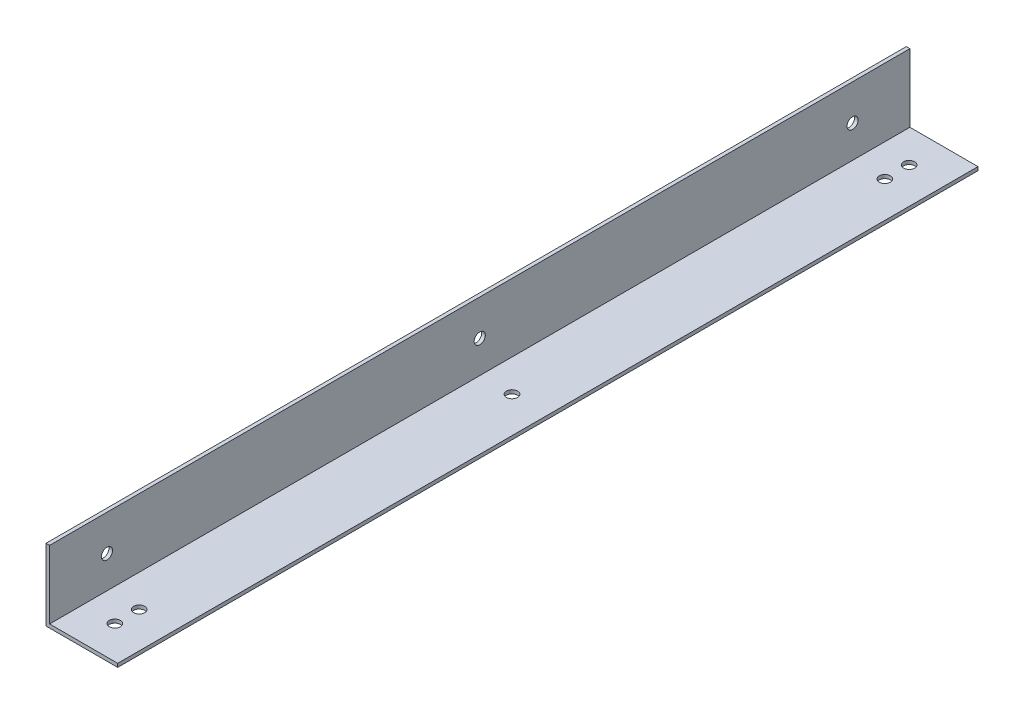
ISO-10303-21;
HEADER;
FILE_DESCRIPTION(('STEP AP214'),'2;1');
FILE_NAME('part.step','',(''),(''),'','','');
FILE_SCHEMA(('AUTOMOTIVE_DESIGN { 1 0 10303 214 1 1 1 1 }'));
ENDSEC;
DATA;
#1=APPLICATION_CONTEXT('core data for automotive mechanical design processes');
#2=APPLICATION_PROTOCOL_DEFINITION('international standard','automotive_design',2000,#1);
#3=PRODUCT_CONTEXT('',#1,'mechanical');
#4=PRODUCT('Part','Part','',(#3));
#5=PRODUCT_RELATED_PRODUCT_CATEGORY('part','',(#4));
#6=PRODUCT_DEFINITION_FORMATION('','',#4);
#7=PRODUCT_DEFINITION_CONTEXT('part definition',#1,'design');
#8=PRODUCT_DEFINITION('design','',#6,#7);
#9=PRODUCT_DEFINITION_SHAPE('','',#8);
#10=(LENGTH_UNIT() NAMED_UNIT(*) SI_UNIT(.MILLI.,.METRE.));
#11=(NAMED_UNIT(*) PLANE_ANGLE_UNIT() SI_UNIT($,.RADIAN.));
#12=(NAMED_UNIT(*) SI_UNIT($,.STERADIAN.) SOLID_ANGLE_UNIT());
#13=UNCERTAINTY_MEASURE_WITH_UNIT(LENGTH_MEASURE(1.E-05),#10,'distance_accuracy_value','');
#14=(GEOMETRIC_REPRESENTATION_CONTEXT(3) GLOBAL_UNCERTAINTY_ASSIGNED_CONTEXT((#13)) GLOBAL_UNIT_ASSIGNED_CONTEXT((#10,
#11,#12)) REPRESENTATION_CONTEXT('',''));
#15=CARTESIAN_POINT('',(0.,0.,0.));
#16=DIRECTION('',(0.,0.,1.));
#17=DIRECTION('',(1.,0.,0.));
#18=AXIS2_PLACEMENT_3D('',#15,#16,#17);
#19=CARTESIAN_POINT('',(31.75,0.,381.));
#20=DIRECTION('',(0.,1.,0.));
#21=DIRECTION('',(-1.,0.,0.));
#22=AXIS2_PLACEMENT_3D('',#19,#20,#21);
#23=PLANE('',#22);
#24=CARTESIAN_POINT('',(15.875,0.,190.5));
#25=DIRECTION('',(0.,-1.,0.));
#26=DIRECTION('',(0.,0.,-1.));
#27=AXIS2_PLACEMENT_3D('',#24,#25,#26);
#28=CIRCLE('',#27,2.45744999999999);
#29=CARTESIAN_POINT('',(15.875,0.,188.04255));
#30=VERTEX_POINT('',#29);
#31=EDGE_CURVE('E165',#30,#30,#28,.T.);
#32=ORIENTED_EDGE('',*,*,#31,.F.);
#33=EDGE_LOOP('',(#32));
#34=FACE_BOUND('',#33,.T.);
#35=CARTESIAN_POINT('',(15.875,0.,25.4));
#36=DIRECTION('',(0.,-1.,0.));
#37=DIRECTION('',(0.,0.,-1.));
#38=AXIS2_PLACEMENT_3D('',#35,#36,#37);
#39=CIRCLE('',#38,2.45744999999999);
#40=CARTESIAN_POINT('',(15.875,0.,22.94255));
#41=VERTEX_POINT('',#40);
#42=EDGE_CURVE('E169',#41,#41,#39,.T.);
#43=ORIENTED_EDGE('',*,*,#42,.F.);
#44=EDGE_LOOP('',(#43));
#45=FACE_BOUND('',#44,.T.);
#46=CARTESIAN_POINT('',(15.875,0.,355.6));
#47=DIRECTION('',(0.,-1.,0.));
#48=DIRECTION('',(0.,0.,-1.));
#49=AXIS2_PLACEMENT_3D('',#46,#47,#48);
#50=CIRCLE('',#49,2.45744999999999);
#51=CARTESIAN_POINT('',(15.875,0.,353.14255));
#52=VERTEX_POINT('',#51);
#53=EDGE_CURVE('E173',#52,#52,#50,.T.);
#54=ORIENTED_EDGE('',*,*,#53,.F.);
#55=EDGE_LOOP('',(#54));
#56=FACE_BOUND('',#55,.T.);
#57=CARTESIAN_POINT('',(15.875,0.,14.605));
#58=DIRECTION('',(0.,-1.,0.));
#59=DIRECTION('',(0.,0.,-1.));
#60=AXIS2_PLACEMENT_3D('',#57,#58,#59);
#61=CIRCLE('',#60,2.45744999999999);
#62=CARTESIAN_POINT('',(15.875,0.,12.14755));
#63=VERTEX_POINT('',#62);
#64=EDGE_CURVE('E177',#63,#63,#61,.T.);
#65=ORIENTED_EDGE('',*,*,#64,.F.);
#66=EDGE_LOOP('',(#65));
#67=FACE_BOUND('',#66,.T.);
#68=CARTESIAN_POINT('',(15.875,0.,366.395));
#69=DIRECTION('',(0.,-1.,0.));
#70=DIRECTION('',(0.,0.,-1.));
#71=AXIS2_PLACEMENT_3D('',#68,#69,#70);
#72=CIRCLE('',#71,2.45744999999999);
#73=CARTESIAN_POINT('',(15.875,0.,363.93755));
#74=VERTEX_POINT('',#73);
#75=EDGE_CURVE('E180',#74,#74,#72,.T.);
#76=ORIENTED_EDGE('',*,*,#75,.F.);
#77=EDGE_LOOP('',(#76));
#78=FACE_BOUND('',#77,.T.);
#79=DIRECTION('',(1.,0.,0.));
#80=VECTOR('',#79,1.);
#81=CARTESIAN_POINT('',(31.75,0.,0.));
#82=LINE('',#81,#80);
#83=CARTESIAN_POINT('',(0.,0.,0.));
#84=VERTEX_POINT('',#83);
#85=CARTESIAN_POINT('',(31.75,0.,0.));
#86=VERTEX_POINT('',#85);
#87=EDGE_CURVE('E118',#84,#86,#82,.T.);
#88=ORIENTED_EDGE('',*,*,#87,.T.);
#89=DIRECTION('',(0.,0.,-1.));
#90=VECTOR('',#89,1.);
#91=CARTESIAN_POINT('',(31.75,0.,381.));
#92=LINE('',#91,#90);
#93=CARTESIAN_POINT('',(31.75,0.,381.));
#94=VERTEX_POINT('',#93);
#95=EDGE_CURVE('E11',#94,#86,#92,.T.);
#96=ORIENTED_EDGE('',*,*,#95,.F.);
#97=DIRECTION('',(1.,0.,0.));
#98=VECTOR('',#97,1.);
#99=CARTESIAN_POINT('',(31.75,0.,381.));
#100=LINE('',#99,#98);
#101=CARTESIAN_POINT('',(0.,0.,381.));
#102=VERTEX_POINT('',#101);
#103=EDGE_CURVE('E129',#102,#94,#100,.T.);
#104=ORIENTED_EDGE('',*,*,#103,.F.);
#105=DIRECTION('',(0.,0.,-1.));
#106=VECTOR('',#105,1.);
#107=CARTESIAN_POINT('',(0.,0.,381.));
#108=LINE('',#107,#106);
#109=EDGE_CURVE('E114',#102,#84,#108,.T.);
#110=ORIENTED_EDGE('',*,*,#109,.T.);
#111=EDGE_LOOP('',(#88,#96,#104,#110));
#112=FACE_BOUND('',#111,.T.);
#113=ADVANCED_FACE('F33',(#34,#45,#56,#67,#78,#112),#23,.F.);
#114=CARTESIAN_POINT('',(31.75,1.5875,381.));
#115=DIRECTION('',(-1.,0.,0.));
#116=DIRECTION('',(0.,0.,1.));
#117=AXIS2_PLACEMENT_3D('',#114,#115,#116);
#118=PLANE('',#117);
#119=DIRECTION('',(0.,1.,0.));
#120=VECTOR('',#119,1.);
#121=CARTESIAN_POINT('',(31.75,1.5875,0.));
#122=LINE('',#121,#120);
#123=CARTESIAN_POINT('',(31.75,1.5875,0.));
#124=VERTEX_POINT('',#123);
#125=EDGE_CURVE('E121',#86,#124,#122,.T.);
#126=ORIENTED_EDGE('',*,*,#125,.T.);
#127=DIRECTION('',(0.,0.,-1.));
#128=VECTOR('',#127,1.);
#129=CARTESIAN_POINT('',(31.75,1.5875,381.));
#130=LINE('',#129,#128);
#131=CARTESIAN_POINT('',(31.75,1.5875,381.));
#132=VERTEX_POINT('',#131);
#133=EDGE_CURVE('E42',#132,#124,#130,.T.);
#134=ORIENTED_EDGE('',*,*,#133,.F.);
#135=DIRECTION('',(0.,1.,0.));
#136=VECTOR('',#135,1.);
#137=CARTESIAN_POINT('',(31.75,1.5875,381.));
#138=LINE('',#137,#136);
#139=EDGE_CURVE('E87',#94,#132,#138,.T.);
#140=ORIENTED_EDGE('',*,*,#139,.F.);
#141=ORIENTED_EDGE('',*,*,#95,.T.);
#142=EDGE_LOOP('',(#126,#134,#140,#141));
#143=FACE_BOUND('',#142,.T.);
#144=ADVANCED_FACE('F157',(#143),#118,.F.);
#145=CARTESIAN_POINT('',(1.5875,1.5875,381.));
#146=DIRECTION('',(0.,-1.,0.));
#147=DIRECTION('',(1.,0.,0.));
#148=AXIS2_PLACEMENT_3D('',#145,#146,#147);
#149=PLANE('',#148);
#150=CARTESIAN_POINT('',(15.875,1.5875,190.5));
#151=DIRECTION('',(0.,-1.,0.));
#152=DIRECTION('',(1.,0.,0.));
#153=AXIS2_PLACEMENT_3D('',#150,#151,#152);
#154=CIRCLE('',#153,2.45744999999999);
#155=CARTESIAN_POINT('',(18.33245,1.5875,190.5));
#156=VERTEX_POINT('',#155);
#157=EDGE_CURVE('E251',#156,#156,#154,.T.);
#158=ORIENTED_EDGE('',*,*,#157,.T.);
#159=EDGE_LOOP('',(#158));
#160=FACE_BOUND('',#159,.T.);
#161=CARTESIAN_POINT('',(15.875,1.5875,25.4));
#162=DIRECTION('',(0.,-1.,0.));
#163=DIRECTION('',(1.,0.,0.));
#164=AXIS2_PLACEMENT_3D('',#161,#162,#163);
#165=CIRCLE('',#164,2.45744999999999);
#166=CARTESIAN_POINT('',(18.33245,1.5875,25.4));
#167=VERTEX_POINT('',#166);
#168=EDGE_CURVE('E36',#167,#167,#165,.T.);
#169=ORIENTED_EDGE('',*,*,#168,.T.);
#170=EDGE_LOOP('',(#169));
#171=FACE_BOUND('',#170,.T.);
#172=CARTESIAN_POINT('',(15.875,1.5875,355.6));
#173=DIRECTION('',(0.,-1.,0.));
#174=DIRECTION('',(1.,0.,0.));
#175=AXIS2_PLACEMENT_3D('',#172,#173,#174);
#176=CIRCLE('',#175,2.45744999999999);
#177=CARTESIAN_POINT('',(18.33245,1.5875,355.6));
#178=VERTEX_POINT('',#177);
#179=EDGE_CURVE('E258',#178,#178,#176,.T.);
#180=ORIENTED_EDGE('',*,*,#179,.T.);
#181=EDGE_LOOP('',(#180));
#182=FACE_BOUND('',#181,.T.);
#183=CARTESIAN_POINT('',(15.875,1.5875,14.605));
#184=DIRECTION('',(0.,-1.,0.));
#185=DIRECTION('',(1.,0.,0.));
#186=AXIS2_PLACEMENT_3D('',#183,#184,#185);
#187=CIRCLE('',#186,2.45744999999999);
#188=CARTESIAN_POINT('',(18.33245,1.5875,14.605));
#189=VERTEX_POINT('',#188);
#190=EDGE_CURVE('E183',#189,#189,#187,.T.);
#191=ORIENTED_EDGE('',*,*,#190,.T.);
#192=EDGE_LOOP('',(#191));
#193=FACE_BOUND('',#192,.T.);
#194=CARTESIAN_POINT('',(15.875,1.5875,366.395));
#195=DIRECTION('',(0.,-1.,0.));
#196=DIRECTION('',(1.,0.,0.));
#197=AXIS2_PLACEMENT_3D('',#194,#195,#196);
#198=CIRCLE('',#197,2.45744999999999);
#199=CARTESIAN_POINT('',(18.3324499999999,1.5875,366.395));
#200=VERTEX_POINT('',#199);
#201=EDGE_CURVE('E182',#200,#200,#198,.T.);
#202=ORIENTED_EDGE('',*,*,#201,.T.);
#203=EDGE_LOOP('',(#202));
#204=FACE_BOUND('',#203,.T.);
#205=DIRECTION('',(-1.,0.,0.));
#206=VECTOR('',#205,1.);
#207=CARTESIAN_POINT('',(1.5875,1.5875,0.));
#208=LINE('',#207,#206);
#209=CARTESIAN_POINT('',(1.5875,1.5875,0.));
#210=VERTEX_POINT('',#209);
#211=EDGE_CURVE('E124',#124,#210,#208,.T.);
#212=ORIENTED_EDGE('',*,*,#211,.T.);
#213=DIRECTION('',(0.,0.,-1.));
#214=VECTOR('',#213,1.);
#215=CARTESIAN_POINT('',(1.5875,1.5875,381.));
#216=LINE('',#215,#214);
#217=CARTESIAN_POINT('',(1.5875,1.5875,381.));
#218=VERTEX_POINT('',#217);
#219=EDGE_CURVE('E109',#218,#210,#216,.T.);
#220=ORIENTED_EDGE('',*,*,#219,.F.);
#221=DIRECTION('',(-1.,0.,0.));
#222=VECTOR('',#221,1.);
#223=CARTESIAN_POINT('',(1.5875,1.5875,381.));
#224=LINE('',#223,#222);
#225=EDGE_CURVE('E100',#132,#218,#224,.T.);
#226=ORIENTED_EDGE('',*,*,#225,.F.);
#227=ORIENTED_EDGE('',*,*,#133,.T.);
#228=EDGE_LOOP('',(#212,#220,#226,#227));
#229=FACE_BOUND('',#228,.T.);
#230=ADVANCED_FACE('F136',(#160,#171,#182,#193,#204,#229),#149,.F.);
#231=CARTESIAN_POINT('',(1.5875,31.75,381.));
#232=DIRECTION('',(-1.,0.,0.));
#233=DIRECTION('',(0.,-1.,0.));
#234=AXIS2_PLACEMENT_3D('',#231,#232,#233);
#235=PLANE('',#234);
#236=CARTESIAN_POINT('',(1.5875,15.875,25.4));
#237=DIRECTION('',(-1.,0.,0.));
#238=DIRECTION('',(0.,-1.,0.));
#239=AXIS2_PLACEMENT_3D('',#236,#237,#238);
#240=CIRCLE('',#239,2.45744999999999);
#241=CARTESIAN_POINT('',(1.5875,13.41755,25.4));
#242=VERTEX_POINT('',#241);
#243=EDGE_CURVE('E194',#242,#242,#240,.T.);
#244=ORIENTED_EDGE('',*,*,#243,.T.);
#245=EDGE_LOOP('',(#244));
#246=FACE_BOUND('',#245,.T.);
#247=CARTESIAN_POINT('',(1.5875,15.875,190.5));
#248=DIRECTION('',(-1.,0.,0.));
#249=DIRECTION('',(0.,-1.,0.));
#250=AXIS2_PLACEMENT_3D('',#247,#248,#249);
#251=CIRCLE('',#250,2.45744999999999);
#252=CARTESIAN_POINT('',(1.5875,13.41755,190.5));
#253=VERTEX_POINT('',#252);
#254=EDGE_CURVE('E200',#253,#253,#251,.T.);
#255=ORIENTED_EDGE('',*,*,#254,.T.);
#256=EDGE_LOOP('',(#255));
#257=FACE_BOUND('',#256,.T.);
#258=CARTESIAN_POINT('',(1.5875,15.875,355.6));
#259=DIRECTION('',(-1.,0.,0.));
#260=DIRECTION('',(0.,-1.,0.));
#261=AXIS2_PLACEMENT_3D('',#258,#259,#260);
#262=CIRCLE('',#261,2.45744999999999);
#263=CARTESIAN_POINT('',(1.5875,13.41755,355.6));
#264=VERTEX_POINT('',#263);
#265=EDGE_CURVE('E122',#264,#264,#262,.T.);
#266=ORIENTED_EDGE('',*,*,#265,.T.);
#267=EDGE_LOOP('',(#266));
#268=FACE_BOUND('',#267,.T.);
#269=DIRECTION('',(0.,1.,0.));
#270=VECTOR('',#269,1.);
#271=CARTESIAN_POINT('',(1.5875,31.75,0.));
#272=LINE('',#271,#270);
#273=CARTESIAN_POINT('',(1.5875,31.75,0.));
#274=VERTEX_POINT('',#273);
#275=EDGE_CURVE('E108',#210,#274,#272,.T.);
#276=ORIENTED_EDGE('',*,*,#275,.T.);
#277=DIRECTION('',(0.,0.,-1.));
#278=VECTOR('',#277,1.);
#279=CARTESIAN_POINT('',(1.5875,31.75,381.));
#280=LINE('',#279,#278);
#281=CARTESIAN_POINT('',(1.5875,31.75,381.));
#282=VERTEX_POINT('',#281);
#283=EDGE_CURVE('E105',#282,#274,#280,.T.);
#284=ORIENTED_EDGE('',*,*,#283,.F.);
#285=DIRECTION('',(0.,1.,0.));
#286=VECTOR('',#285,1.);
#287=CARTESIAN_POINT('',(1.5875,31.75,381.));
#288=LINE('',#287,#286);
#289=EDGE_CURVE('E94',#218,#282,#288,.T.);
#290=ORIENTED_EDGE('',*,*,#289,.F.);
#291=ORIENTED_EDGE('',*,*,#219,.T.);
#292=EDGE_LOOP('',(#276,#284,#290,#291));
#293=FACE_BOUND('',#292,.T.);
#294=ADVANCED_FACE('F106',(#246,#257,#268,#293),#235,.F.);
#295=CARTESIAN_POINT('',(0.,31.75,381.));
#296=DIRECTION('',(0.,-1.,0.));
#297=DIRECTION('',(0.,0.,-1.));
#298=AXIS2_PLACEMENT_3D('',#295,#296,#297);
#299=PLANE('',#298);
#300=DIRECTION('',(-1.,0.,0.));
#301=VECTOR('',#300,1.);
#302=CARTESIAN_POINT('',(0.,31.75,0.));
#303=LINE('',#302,#301);
#304=CARTESIAN_POINT('',(0.,31.75,0.));
#305=VERTEX_POINT('',#304);
#306=EDGE_CURVE('E73',#274,#305,#303,.T.);
#307=ORIENTED_EDGE('',*,*,#306,.T.);
#308=DIRECTION('',(0.,0.,-1.));
#309=VECTOR('',#308,1.);
#310=CARTESIAN_POINT('',(0.,31.75,381.));
#311=LINE('',#310,#309);
#312=CARTESIAN_POINT('',(0.,31.75,381.));
#313=VERTEX_POINT('',#312);
#314=EDGE_CURVE('E110',#313,#305,#311,.T.);
#315=ORIENTED_EDGE('',*,*,#314,.F.);
#316=DIRECTION('',(-1.,0.,0.));
#317=VECTOR('',#316,1.);
#318=CARTESIAN_POINT('',(0.,31.75,381.));
#319=LINE('',#318,#317);
#320=EDGE_CURVE('E98',#282,#313,#319,.T.);
#321=ORIENTED_EDGE('',*,*,#320,.F.);
#322=ORIENTED_EDGE('',*,*,#283,.T.);
#323=EDGE_LOOP('',(#307,#315,#321,#322));
#324=FACE_BOUND('',#323,.T.);
#325=ADVANCED_FACE('F112',(#324),#299,.F.);
#326=CARTESIAN_POINT('',(0.,0.,381.));
#327=DIRECTION('',(1.,0.,0.));
#328=DIRECTION('',(0.,0.,-1.));
#329=AXIS2_PLACEMENT_3D('',#326,#327,#328);
#330=PLANE('',#329);
#331=CARTESIAN_POINT('',(0.,15.875,25.4));
#332=DIRECTION('',(-1.,0.,0.));
#333=DIRECTION('',(0.,0.,1.));
#334=AXIS2_PLACEMENT_3D('',#331,#332,#333);
#335=CIRCLE('',#334,2.45744999999999);
#336=CARTESIAN_POINT('',(0.,15.875,27.85745));
#337=VERTEX_POINT('',#336);
#338=EDGE_CURVE('E186',#337,#337,#335,.T.);
#339=ORIENTED_EDGE('',*,*,#338,.F.);
#340=EDGE_LOOP('',(#339));
#341=FACE_BOUND('',#340,.T.);
#342=CARTESIAN_POINT('',(0.,15.875,190.5));
#343=DIRECTION('',(-1.,0.,0.));
#344=DIRECTION('',(0.,0.,1.));
#345=AXIS2_PLACEMENT_3D('',#342,#343,#344);
#346=CIRCLE('',#345,2.45744999999999);
#347=CARTESIAN_POINT('',(0.,15.875,192.95745));
#348=VERTEX_POINT('',#347);
#349=EDGE_CURVE('E197',#348,#348,#346,.T.);
#350=ORIENTED_EDGE('',*,*,#349,.F.);
#351=EDGE_LOOP('',(#350));
#352=FACE_BOUND('',#351,.T.);
#353=CARTESIAN_POINT('',(0.,15.875,355.6));
#354=DIRECTION('',(-1.,0.,0.));
#355=DIRECTION('',(0.,0.,1.));
#356=AXIS2_PLACEMENT_3D('',#353,#354,#355);
#357=CIRCLE('',#356,2.45744999999999);
#358=CARTESIAN_POINT('',(0.,15.875,358.05745));
#359=VERTEX_POINT('',#358);
#360=EDGE_CURVE('E203',#359,#359,#357,.T.);
#361=ORIENTED_EDGE('',*,*,#360,.F.);
#362=EDGE_LOOP('',(#361));
#363=FACE_BOUND('',#362,.T.);
#364=DIRECTION('',(0.,-1.,0.));
#365=VECTOR('',#364,1.);
#366=CARTESIAN_POINT('',(0.,0.,0.));
#367=LINE('',#366,#365);
#368=EDGE_CURVE('E79',#305,#84,#367,.T.);
#369=ORIENTED_EDGE('',*,*,#368,.T.);
#370=ORIENTED_EDGE('',*,*,#109,.F.);
#371=DIRECTION('',(0.,-1.,0.));
#372=VECTOR('',#371,1.);
#373=CARTESIAN_POINT('',(0.,0.,381.));
#374=LINE('',#373,#372);
#375=EDGE_CURVE('E50',#313,#102,#374,.T.);
#376=ORIENTED_EDGE('',*,*,#375,.F.);
#377=ORIENTED_EDGE('',*,*,#314,.T.);
#378=EDGE_LOOP('',(#369,#370,#376,#377));
#379=FACE_BOUND('',#378,.T.);
#380=ADVANCED_FACE('F143',(#341,#352,#363,#379),#330,.F.);
#381=CARTESIAN_POINT('',(0.,0.,381.));
#382=DIRECTION('',(0.,0.,-1.));
#383=DIRECTION('',(-1.,0.,0.));
#384=AXIS2_PLACEMENT_3D('',#381,#382,#383);
#385=PLANE('',#384);
#386=ORIENTED_EDGE('',*,*,#103,.T.);
#387=ORIENTED_EDGE('',*,*,#139,.T.);
#388=ORIENTED_EDGE('',*,*,#225,.T.);
#389=ORIENTED_EDGE('',*,*,#289,.T.);
#390=ORIENTED_EDGE('',*,*,#320,.T.);
#391=ORIENTED_EDGE('',*,*,#375,.T.);
#392=EDGE_LOOP('',(#386,#387,#388,#389,#390,#391));
#393=FACE_BOUND('',#392,.T.);
#394=ADVANCED_FACE('F96',(#393),#385,.F.);
#395=CARTESIAN_POINT('',(0.,0.,0.));
#396=DIRECTION('',(0.,0.,-1.));
#397=DIRECTION('',(-1.,0.,0.));
#398=AXIS2_PLACEMENT_3D('',#395,#396,#397);
#399=PLANE('',#398);
#400=ORIENTED_EDGE('',*,*,#87,.F.);
#401=ORIENTED_EDGE('',*,*,#368,.F.);
#402=ORIENTED_EDGE('',*,*,#306,.F.);
#403=ORIENTED_EDGE('',*,*,#275,.F.);
#404=ORIENTED_EDGE('',*,*,#211,.F.);
#405=ORIENTED_EDGE('',*,*,#125,.F.);
#406=EDGE_LOOP('',(#400,#401,#402,#403,#404,#405));
#407=FACE_BOUND('',#406,.T.);
#408=ADVANCED_FACE('F139',(#407),#399,.T.);
#409=CARTESIAN_POINT('',(0.,15.875,355.6));
#410=DIRECTION('',(-1.,0.,0.));
#411=DIRECTION('',(0.,0.,1.));
#412=AXIS2_PLACEMENT_3D('',#409,#410,#411);
#413=CYLINDRICAL_SURFACE('',#412,2.45744999999999);
#414=ORIENTED_EDGE('',*,*,#360,.T.);
#415=EDGE_LOOP('',(#414));
#416=FACE_BOUND('',#415,.T.);
#417=ORIENTED_EDGE('',*,*,#265,.F.);
#418=EDGE_LOOP('',(#417));
#419=FACE_BOUND('',#418,.T.);
#420=ADVANCED_FACE('F212',(#416,#419),#413,.F.);
#421=CARTESIAN_POINT('',(0.,15.875,190.5));
#422=DIRECTION('',(-1.,0.,0.));
#423=DIRECTION('',(0.,0.,1.));
#424=AXIS2_PLACEMENT_3D('',#421,#422,#423);
#425=CYLINDRICAL_SURFACE('',#424,2.45744999999999);
#426=ORIENTED_EDGE('',*,*,#349,.T.);
#427=EDGE_LOOP('',(#426));
#428=FACE_BOUND('',#427,.T.);
#429=ORIENTED_EDGE('',*,*,#254,.F.);
#430=EDGE_LOOP('',(#429));
#431=FACE_BOUND('',#430,.T.);
#432=ADVANCED_FACE('F214',(#428,#431),#425,.F.);
#433=CARTESIAN_POINT('',(0.,15.875,25.4));
#434=DIRECTION('',(-1.,0.,0.));
#435=DIRECTION('',(0.,0.,1.));
#436=AXIS2_PLACEMENT_3D('',#433,#434,#435);
#437=CYLINDRICAL_SURFACE('',#436,2.45744999999999);
#438=ORIENTED_EDGE('',*,*,#338,.T.);
#439=EDGE_LOOP('',(#438));
#440=FACE_BOUND('',#439,.T.);
#441=ORIENTED_EDGE('',*,*,#243,.F.);
#442=EDGE_LOOP('',(#441));
#443=FACE_BOUND('',#442,.T.);
#444=ADVANCED_FACE('F221',(#440,#443),#437,.F.);
#445=CARTESIAN_POINT('',(15.875,0.,366.395));
#446=DIRECTION('',(0.,-1.,0.));
#447=DIRECTION('',(0.,0.,-1.));
#448=AXIS2_PLACEMENT_3D('',#445,#446,#447);
#449=CYLINDRICAL_SURFACE('',#448,2.45744999999999);
#450=ORIENTED_EDGE('',*,*,#75,.T.);
#451=EDGE_LOOP('',(#450));
#452=FACE_BOUND('',#451,.T.);
#453=ORIENTED_EDGE('',*,*,#201,.F.);
#454=EDGE_LOOP('',(#453));
#455=FACE_BOUND('',#454,.T.);
#456=ADVANCED_FACE('F227',(#452,#455),#449,.F.);
#457=CARTESIAN_POINT('',(15.875,0.,14.605));
#458=DIRECTION('',(0.,-1.,0.));
#459=DIRECTION('',(0.,0.,-1.));
#460=AXIS2_PLACEMENT_3D('',#457,#458,#459);
#461=CYLINDRICAL_SURFACE('',#460,2.45744999999999);
#462=ORIENTED_EDGE('',*,*,#64,.T.);
#463=EDGE_LOOP('',(#462));
#464=FACE_BOUND('',#463,.T.);
#465=ORIENTED_EDGE('',*,*,#190,.F.);
#466=EDGE_LOOP('',(#465));
#467=FACE_BOUND('',#466,.T.);
#468=ADVANCED_FACE('F231',(#464,#467),#461,.F.);
#469=CARTESIAN_POINT('',(15.875,0.,355.6));
#470=DIRECTION('',(0.,-1.,0.));
#471=DIRECTION('',(0.,0.,-1.));
#472=AXIS2_PLACEMENT_3D('',#469,#470,#471);
#473=CYLINDRICAL_SURFACE('',#472,2.45744999999999);
#474=ORIENTED_EDGE('',*,*,#53,.T.);
#475=EDGE_LOOP('',(#474));
#476=FACE_BOUND('',#475,.T.);
#477=ORIENTED_EDGE('',*,*,#179,.F.);
#478=EDGE_LOOP('',(#477));
#479=FACE_BOUND('',#478,.T.);
#480=ADVANCED_FACE('F234',(#476,#479),#473,.F.);
#481=CARTESIAN_POINT('',(15.875,0.,25.4));
#482=DIRECTION('',(0.,-1.,0.));
#483=DIRECTION('',(0.,0.,-1.));
#484=AXIS2_PLACEMENT_3D('',#481,#482,#483);
#485=CYLINDRICAL_SURFACE('',#484,2.45744999999999);
#486=ORIENTED_EDGE('',*,*,#42,.T.);
#487=EDGE_LOOP('',(#486));
#488=FACE_BOUND('',#487,.T.);
#489=ORIENTED_EDGE('',*,*,#168,.F.);
#490=EDGE_LOOP('',(#489));
#491=FACE_BOUND('',#490,.T.);
#492=ADVANCED_FACE('F238',(#488,#491),#485,.F.);
#493=CARTESIAN_POINT('',(15.875,0.,190.5));
#494=DIRECTION('',(0.,-1.,0.));
#495=DIRECTION('',(0.,0.,-1.));
#496=AXIS2_PLACEMENT_3D('',#493,#494,#495);
#497=CYLINDRICAL_SURFACE('',#496,2.45744999999999);
#498=ORIENTED_EDGE('',*,*,#31,.T.);
#499=EDGE_LOOP('',(#498));
#500=FACE_BOUND('',#499,.T.);
#501=ORIENTED_EDGE('',*,*,#157,.F.);
#502=EDGE_LOOP('',(#501));
#503=FACE_BOUND('',#502,.T.);
#504=ADVANCED_FACE('F242',(#500,#503),#497,.F.);
#505=CLOSED_SHELL('',(#113,#144,#230,#294,#325,#380,#394,#408,#420,#432,#444,#456,#468,#480,
#492,#504));
#506=MANIFOLD_SOLID_BREP('B2',#505);
#507=ADVANCED_BREP_SHAPE_REPRESENTATION('',(#18,#506),#14);
#508=SHAPE_DEFINITION_REPRESENTATION(#9,#507);
ENDSEC;
END-ISO-10303-21;
